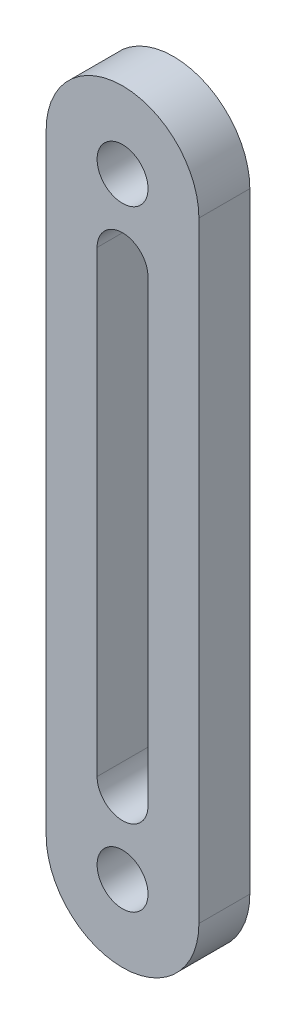
ISO-10303-21;
HEADER;
FILE_DESCRIPTION(('STEP AP214'),'2;1');
FILE_NAME('part.step','',(''),(''),'','','');
FILE_SCHEMA(('AUTOMOTIVE_DESIGN { 1 0 10303 214 1 1 1 1 }'));
ENDSEC;
DATA;
#1=APPLICATION_CONTEXT('core data for automotive mechanical design processes');
#2=APPLICATION_PROTOCOL_DEFINITION('international standard','automotive_design',2000,#1);
#3=PRODUCT_CONTEXT('',#1,'mechanical');
#4=PRODUCT('Part','Part','',(#3));
#5=PRODUCT_RELATED_PRODUCT_CATEGORY('part','',(#4));
#6=PRODUCT_DEFINITION_FORMATION('','',#4);
#7=PRODUCT_DEFINITION_CONTEXT('part definition',#1,'design');
#8=PRODUCT_DEFINITION('design','',#6,#7);
#9=PRODUCT_DEFINITION_SHAPE('','',#8);
#10=(LENGTH_UNIT() NAMED_UNIT(*) SI_UNIT(.MILLI.,.METRE.));
#11=(NAMED_UNIT(*) PLANE_ANGLE_UNIT() SI_UNIT($,.RADIAN.));
#12=(NAMED_UNIT(*) SI_UNIT($,.STERADIAN.) SOLID_ANGLE_UNIT());
#13=UNCERTAINTY_MEASURE_WITH_UNIT(LENGTH_MEASURE(1.E-05),#10,'distance_accuracy_value','');
#14=(GEOMETRIC_REPRESENTATION_CONTEXT(3) GLOBAL_UNCERTAINTY_ASSIGNED_CONTEXT((#13)) GLOBAL_UNIT_ASSIGNED_CONTEXT((#10,
#11,#12)) REPRESENTATION_CONTEXT('',''));
#15=CARTESIAN_POINT('',(0.,0.,0.));
#16=DIRECTION('',(0.,0.,1.));
#17=DIRECTION('',(1.,0.,0.));
#18=AXIS2_PLACEMENT_3D('',#15,#16,#17);
#19=CARTESIAN_POINT('',(208.7507761496,152.428489513,3.));
#20=DIRECTION('',(0.,0.,1.));
#21=DIRECTION('',(1.,0.,0.));
#22=AXIS2_PLACEMENT_3D('',#19,#20,#21);
#23=PLANE('',#22);
#24=CARTESIAN_POINT('',(208.7507761496,152.428489513,3.));
#25=DIRECTION('',(0.,0.,1.));
#26=DIRECTION('',(1.,0.,0.));
#27=AXIS2_PLACEMENT_3D('',#24,#25,#26);
#28=CIRCLE('',#27,1.5);
#29=CARTESIAN_POINT('',(210.2507761496,152.428489513,3.));
#30=VERTEX_POINT('',#29);
#31=EDGE_CURVE('E134',#30,#30,#28,.T.);
#32=ORIENTED_EDGE('',*,*,#31,.F.);
#33=EDGE_LOOP('',(#32));
#34=FACE_BOUND('',#33,.T.);
#35=CARTESIAN_POINT('',(208.7507761496,152.428489513,3.));
#36=DIRECTION('',(0.,0.,1.));
#37=DIRECTION('',(1.,0.,0.));
#38=AXIS2_PLACEMENT_3D('',#35,#36,#37);
#39=CIRCLE('',#38,4.5);
#40=CARTESIAN_POINT('',(204.2507761496,152.428489513,3.));
#41=VERTEX_POINT('',#40);
#42=CARTESIAN_POINT('',(213.2507761496,152.428489513,3.));
#43=VERTEX_POINT('',#42);
#44=EDGE_CURVE('E146',#41,#43,#39,.T.);
#45=ORIENTED_EDGE('',*,*,#44,.T.);
#46=DIRECTION('',(0.,1.,0.));
#47=VECTOR('',#46,1.);
#48=CARTESIAN_POINT('',(213.2507761496,152.428489513,3.));
#49=LINE('',#48,#47);
#50=CARTESIAN_POINT('',(213.2507761496,188.428489513,3.));
#51=VERTEX_POINT('',#50);
#52=EDGE_CURVE('E149',#43,#51,#49,.T.);
#53=ORIENTED_EDGE('',*,*,#52,.T.);
#54=CARTESIAN_POINT('',(208.7507761496,188.428489513,3.));
#55=DIRECTION('',(0.,0.,1.));
#56=DIRECTION('',(1.,0.,0.));
#57=AXIS2_PLACEMENT_3D('',#54,#55,#56);
#58=CIRCLE('',#57,4.5);
#59=CARTESIAN_POINT('',(204.2507761496,188.428489513,3.));
#60=VERTEX_POINT('',#59);
#61=EDGE_CURVE('E152',#51,#60,#58,.T.);
#62=ORIENTED_EDGE('',*,*,#61,.T.);
#63=DIRECTION('',(0.,-1.,0.));
#64=VECTOR('',#63,1.);
#65=CARTESIAN_POINT('',(204.2507761496,188.428489513,3.));
#66=LINE('',#65,#64);
#67=EDGE_CURVE('E154',#60,#41,#66,.T.);
#68=ORIENTED_EDGE('',*,*,#67,.T.);
#69=EDGE_LOOP('',(#45,#53,#62,#68));
#70=FACE_BOUND('',#69,.T.);
#71=CARTESIAN_POINT('',(208.7507761496,188.428489513,3.));
#72=DIRECTION('',(0.,0.,1.));
#73=DIRECTION('',(1.,0.,0.));
#74=AXIS2_PLACEMENT_3D('',#71,#72,#73);
#75=CIRCLE('',#74,1.5);
#76=CARTESIAN_POINT('',(210.2507761496,188.428489513,3.));
#77=VERTEX_POINT('',#76);
#78=EDGE_CURVE('E140',#77,#77,#75,.T.);
#79=ORIENTED_EDGE('',*,*,#78,.F.);
#80=EDGE_LOOP('',(#79));
#81=FACE_BOUND('',#80,.T.);
#82=DIRECTION('',(0.,-1.,0.));
#83=VECTOR('',#82,1.);
#84=CARTESIAN_POINT('',(207.2507761496,183.928489513,3.));
#85=LINE('',#84,#83);
#86=CARTESIAN_POINT('',(207.2507761496,183.928489513,3.));
#87=VERTEX_POINT('',#86);
#88=CARTESIAN_POINT('',(207.2507761496,156.928489513,3.));
#89=VERTEX_POINT('',#88);
#90=EDGE_CURVE('E106',#87,#89,#85,.T.);
#91=ORIENTED_EDGE('',*,*,#90,.F.);
#92=CARTESIAN_POINT('',(208.7507761496,183.928489513,3.));
#93=DIRECTION('',(0.,0.,1.));
#94=DIRECTION('',(1.,0.,0.));
#95=AXIS2_PLACEMENT_3D('',#92,#93,#94);
#96=CIRCLE('',#95,1.5);
#97=CARTESIAN_POINT('',(210.2507761496,183.928489513,3.));
#98=VERTEX_POINT('',#97);
#99=EDGE_CURVE('E98',#98,#87,#96,.T.);
#100=ORIENTED_EDGE('',*,*,#99,.F.);
#101=DIRECTION('',(0.,1.,0.));
#102=VECTOR('',#101,1.);
#103=CARTESIAN_POINT('',(210.2507761496,156.928489513,3.));
#104=LINE('',#103,#102);
#105=CARTESIAN_POINT('',(210.2507761496,156.928489513,3.));
#106=VERTEX_POINT('',#105);
#107=EDGE_CURVE('E120',#106,#98,#104,.T.);
#108=ORIENTED_EDGE('',*,*,#107,.F.);
#109=CARTESIAN_POINT('',(208.7507761496,156.928489513,3.));
#110=DIRECTION('',(0.,0.,1.));
#111=DIRECTION('',(1.,0.,0.));
#112=AXIS2_PLACEMENT_3D('',#109,#110,#111);
#113=CIRCLE('',#112,1.5);
#114=EDGE_CURVE('E118',#89,#106,#113,.T.);
#115=ORIENTED_EDGE('',*,*,#114,.F.);
#116=EDGE_LOOP('',(#91,#100,#108,#115));
#117=FACE_BOUND('',#116,.T.);
#118=ADVANCED_FACE('F33',(#34,#70,#81,#117),#23,.T.);
#119=CARTESIAN_POINT('',(208.7507761496,152.428489513,0.));
#120=DIRECTION('',(0.,0.,1.));
#121=DIRECTION('',(1.,0.,0.));
#122=AXIS2_PLACEMENT_3D('',#119,#120,#121);
#123=PLANE('',#122);
#124=CARTESIAN_POINT('',(208.7507761496,152.428489513,0.));
#125=DIRECTION('',(0.,0.,1.));
#126=DIRECTION('',(1.,0.,0.));
#127=AXIS2_PLACEMENT_3D('',#124,#125,#126);
#128=CIRCLE('',#127,1.5);
#129=CARTESIAN_POINT('',(210.2507761496,152.428489513,0.));
#130=VERTEX_POINT('',#129);
#131=EDGE_CURVE('E114',#130,#130,#128,.T.);
#132=ORIENTED_EDGE('',*,*,#131,.T.);
#133=EDGE_LOOP('',(#132));
#134=FACE_BOUND('',#133,.T.);
#135=CARTESIAN_POINT('',(208.7507761496,152.428489513,0.));
#136=DIRECTION('',(0.,0.,1.));
#137=DIRECTION('',(1.,0.,0.));
#138=AXIS2_PLACEMENT_3D('',#135,#136,#137);
#139=CIRCLE('',#138,4.5);
#140=CARTESIAN_POINT('',(204.2507761496,152.428489513,0.));
#141=VERTEX_POINT('',#140);
#142=CARTESIAN_POINT('',(213.2507761496,152.428489513,0.));
#143=VERTEX_POINT('',#142);
#144=EDGE_CURVE('E143',#141,#143,#139,.T.);
#145=ORIENTED_EDGE('',*,*,#144,.F.);
#146=DIRECTION('',(0.,-1.,0.));
#147=VECTOR('',#146,1.);
#148=CARTESIAN_POINT('',(204.2507761496,188.428489513,0.));
#149=LINE('',#148,#147);
#150=CARTESIAN_POINT('',(204.2507761496,188.428489513,0.));
#151=VERTEX_POINT('',#150);
#152=EDGE_CURVE('E150',#151,#141,#149,.T.);
#153=ORIENTED_EDGE('',*,*,#152,.F.);
#154=CARTESIAN_POINT('',(208.7507761496,188.428489513,0.));
#155=DIRECTION('',(0.,0.,1.));
#156=DIRECTION('',(1.,0.,0.));
#157=AXIS2_PLACEMENT_3D('',#154,#155,#156);
#158=CIRCLE('',#157,4.5);
#159=CARTESIAN_POINT('',(213.2507761496,188.428489513,0.));
#160=VERTEX_POINT('',#159);
#161=EDGE_CURVE('E161',#160,#151,#158,.T.);
#162=ORIENTED_EDGE('',*,*,#161,.F.);
#163=DIRECTION('',(0.,1.,0.));
#164=VECTOR('',#163,1.);
#165=CARTESIAN_POINT('',(213.2507761496,152.428489513,0.));
#166=LINE('',#165,#164);
#167=EDGE_CURVE('E159',#143,#160,#166,.T.);
#168=ORIENTED_EDGE('',*,*,#167,.F.);
#169=EDGE_LOOP('',(#145,#153,#162,#168));
#170=FACE_BOUND('',#169,.T.);
#171=CARTESIAN_POINT('',(208.7507761496,188.428489513,0.));
#172=DIRECTION('',(0.,0.,1.));
#173=DIRECTION('',(1.,0.,0.));
#174=AXIS2_PLACEMENT_3D('',#171,#172,#173);
#175=CIRCLE('',#174,1.5);
#176=CARTESIAN_POINT('',(210.2507761496,188.428489513,0.));
#177=VERTEX_POINT('',#176);
#178=EDGE_CURVE('E137',#177,#177,#175,.T.);
#179=ORIENTED_EDGE('',*,*,#178,.T.);
#180=EDGE_LOOP('',(#179));
#181=FACE_BOUND('',#180,.T.);
#182=CARTESIAN_POINT('',(208.7507761496,183.928489513,0.));
#183=DIRECTION('',(0.,0.,1.));
#184=DIRECTION('',(1.,0.,0.));
#185=AXIS2_PLACEMENT_3D('',#182,#183,#184);
#186=CIRCLE('',#185,1.5);
#187=CARTESIAN_POINT('',(210.2507761496,183.928489513,0.));
#188=VERTEX_POINT('',#187);
#189=CARTESIAN_POINT('',(207.2507761496,183.928489513,0.));
#190=VERTEX_POINT('',#189);
#191=EDGE_CURVE('E56',#188,#190,#186,.T.);
#192=ORIENTED_EDGE('',*,*,#191,.T.);
#193=DIRECTION('',(0.,-1.,0.));
#194=VECTOR('',#193,1.);
#195=CARTESIAN_POINT('',(207.2507761496,183.928489513,0.));
#196=LINE('',#195,#194);
#197=CARTESIAN_POINT('',(207.2507761496,156.928489513,0.));
#198=VERTEX_POINT('',#197);
#199=EDGE_CURVE('E113',#190,#198,#196,.T.);
#200=ORIENTED_EDGE('',*,*,#199,.T.);
#201=CARTESIAN_POINT('',(208.7507761496,156.928489513,0.));
#202=DIRECTION('',(0.,0.,1.));
#203=DIRECTION('',(1.,0.,0.));
#204=AXIS2_PLACEMENT_3D('',#201,#202,#203);
#205=CIRCLE('',#204,1.5);
#206=CARTESIAN_POINT('',(210.2507761496,156.928489513,0.));
#207=VERTEX_POINT('',#206);
#208=EDGE_CURVE('E126',#198,#207,#205,.T.);
#209=ORIENTED_EDGE('',*,*,#208,.T.);
#210=DIRECTION('',(0.,1.,0.));
#211=VECTOR('',#210,1.);
#212=CARTESIAN_POINT('',(210.2507761496,156.928489513,0.));
#213=LINE('',#212,#211);
#214=EDGE_CURVE('E107',#207,#188,#213,.T.);
#215=ORIENTED_EDGE('',*,*,#214,.T.);
#216=EDGE_LOOP('',(#192,#200,#209,#215));
#217=FACE_BOUND('',#216,.T.);
#218=ADVANCED_FACE('F179',(#134,#170,#181,#217),#123,.F.);
#219=CARTESIAN_POINT('',(208.7507761496,152.428489513,3.));
#220=DIRECTION('',(0.,0.,-1.));
#221=DIRECTION('',(-1.,0.,0.));
#222=AXIS2_PLACEMENT_3D('',#219,#220,#221);
#223=CYLINDRICAL_SURFACE('',#222,4.5);
#224=ORIENTED_EDGE('',*,*,#144,.T.);
#225=DIRECTION('',(0.,0.,-1.));
#226=VECTOR('',#225,1.);
#227=CARTESIAN_POINT('',(213.2507761496,152.428489513,3.));
#228=LINE('',#227,#226);
#229=EDGE_CURVE('E11',#43,#143,#228,.T.);
#230=ORIENTED_EDGE('',*,*,#229,.F.);
#231=ORIENTED_EDGE('',*,*,#44,.F.);
#232=DIRECTION('',(0.,0.,-1.));
#233=VECTOR('',#232,1.);
#234=CARTESIAN_POINT('',(204.2507761496,152.428489513,3.));
#235=LINE('',#234,#233);
#236=EDGE_CURVE('E156',#41,#141,#235,.T.);
#237=ORIENTED_EDGE('',*,*,#236,.T.);
#238=EDGE_LOOP('',(#224,#230,#231,#237));
#239=FACE_BOUND('',#238,.T.);
#240=ADVANCED_FACE('F35',(#239),#223,.T.);
#241=CARTESIAN_POINT('',(213.2507761496,152.428489513,3.));
#242=DIRECTION('',(-1.,0.,0.));
#243=DIRECTION('',(0.,0.,1.));
#244=AXIS2_PLACEMENT_3D('',#241,#242,#243);
#245=PLANE('',#244);
#246=ORIENTED_EDGE('',*,*,#167,.T.);
#247=DIRECTION('',(0.,0.,-1.));
#248=VECTOR('',#247,1.);
#249=CARTESIAN_POINT('',(213.2507761496,188.428489513,3.));
#250=LINE('',#249,#248);
#251=EDGE_CURVE('E41',#51,#160,#250,.T.);
#252=ORIENTED_EDGE('',*,*,#251,.F.);
#253=ORIENTED_EDGE('',*,*,#52,.F.);
#254=ORIENTED_EDGE('',*,*,#229,.T.);
#255=EDGE_LOOP('',(#246,#252,#253,#254));
#256=FACE_BOUND('',#255,.T.);
#257=ADVANCED_FACE('F190',(#256),#245,.F.);
#258=CARTESIAN_POINT('',(208.7507761496,188.428489513,3.));
#259=DIRECTION('',(0.,0.,-1.));
#260=DIRECTION('',(-1.,0.,0.));
#261=AXIS2_PLACEMENT_3D('',#258,#259,#260);
#262=CYLINDRICAL_SURFACE('',#261,4.5);
#263=ORIENTED_EDGE('',*,*,#161,.T.);
#264=DIRECTION('',(0.,0.,-1.));
#265=VECTOR('',#264,1.);
#266=CARTESIAN_POINT('',(204.2507761496,188.428489513,3.));
#267=LINE('',#266,#265);
#268=EDGE_CURVE('E166',#60,#151,#267,.T.);
#269=ORIENTED_EDGE('',*,*,#268,.F.);
#270=ORIENTED_EDGE('',*,*,#61,.F.);
#271=ORIENTED_EDGE('',*,*,#251,.T.);
#272=EDGE_LOOP('',(#263,#269,#270,#271));
#273=FACE_BOUND('',#272,.T.);
#274=ADVANCED_FACE('F173',(#273),#262,.T.);
#275=CARTESIAN_POINT('',(204.2507761496,188.428489513,3.));
#276=DIRECTION('',(1.,0.,0.));
#277=DIRECTION('',(0.,0.,-1.));
#278=AXIS2_PLACEMENT_3D('',#275,#276,#277);
#279=PLANE('',#278);
#280=ORIENTED_EDGE('',*,*,#152,.T.);
#281=ORIENTED_EDGE('',*,*,#236,.F.);
#282=ORIENTED_EDGE('',*,*,#67,.F.);
#283=ORIENTED_EDGE('',*,*,#268,.T.);
#284=EDGE_LOOP('',(#280,#281,#282,#283));
#285=FACE_BOUND('',#284,.T.);
#286=ADVANCED_FACE('F183',(#285),#279,.F.);
#287=CARTESIAN_POINT('',(208.7507761496,188.428489513,3.));
#288=DIRECTION('',(0.,0.,-1.));
#289=DIRECTION('',(-1.,0.,0.));
#290=AXIS2_PLACEMENT_3D('',#287,#288,#289);
#291=CYLINDRICAL_SURFACE('',#290,1.5);
#292=ORIENTED_EDGE('',*,*,#78,.T.);
#293=EDGE_LOOP('',(#292));
#294=FACE_BOUND('',#293,.T.);
#295=ORIENTED_EDGE('',*,*,#178,.F.);
#296=EDGE_LOOP('',(#295));
#297=FACE_BOUND('',#296,.T.);
#298=ADVANCED_FACE('F207',(#294,#297),#291,.F.);
#299=CARTESIAN_POINT('',(208.7507761496,152.428489513,3.));
#300=DIRECTION('',(0.,0.,-1.));
#301=DIRECTION('',(-1.,0.,0.));
#302=AXIS2_PLACEMENT_3D('',#299,#300,#301);
#303=CYLINDRICAL_SURFACE('',#302,1.5);
#304=ORIENTED_EDGE('',*,*,#31,.T.);
#305=EDGE_LOOP('',(#304));
#306=FACE_BOUND('',#305,.T.);
#307=ORIENTED_EDGE('',*,*,#131,.F.);
#308=EDGE_LOOP('',(#307));
#309=FACE_BOUND('',#308,.T.);
#310=ADVANCED_FACE('F214',(#306,#309),#303,.F.);
#311=CARTESIAN_POINT('',(208.7507761496,183.928489513,3.));
#312=DIRECTION('',(0.,0.,-1.));
#313=DIRECTION('',(-1.,0.,0.));
#314=AXIS2_PLACEMENT_3D('',#311,#312,#313);
#315=CYLINDRICAL_SURFACE('',#314,1.5);
#316=ORIENTED_EDGE('',*,*,#191,.F.);
#317=DIRECTION('',(0.,0.,-1.));
#318=VECTOR('',#317,1.);
#319=CARTESIAN_POINT('',(210.2507761496,183.928489513,3.));
#320=LINE('',#319,#318);
#321=EDGE_CURVE('E102',#98,#188,#320,.T.);
#322=ORIENTED_EDGE('',*,*,#321,.F.);
#323=ORIENTED_EDGE('',*,*,#99,.T.);
#324=DIRECTION('',(0.,0.,-1.));
#325=VECTOR('',#324,1.);
#326=CARTESIAN_POINT('',(207.2507761496,183.928489513,3.));
#327=LINE('',#326,#325);
#328=EDGE_CURVE('E101',#87,#190,#327,.T.);
#329=ORIENTED_EDGE('',*,*,#328,.T.);
#330=EDGE_LOOP('',(#316,#322,#323,#329));
#331=FACE_BOUND('',#330,.T.);
#332=ADVANCED_FACE('F100',(#331),#315,.F.);
#333=CARTESIAN_POINT('',(207.2507761496,183.928489513,3.));
#334=DIRECTION('',(1.,0.,0.));
#335=DIRECTION('',(0.,0.,-1.));
#336=AXIS2_PLACEMENT_3D('',#333,#334,#335);
#337=PLANE('',#336);
#338=ORIENTED_EDGE('',*,*,#199,.F.);
#339=ORIENTED_EDGE('',*,*,#328,.F.);
#340=ORIENTED_EDGE('',*,*,#90,.T.);
#341=DIRECTION('',(0.,0.,-1.));
#342=VECTOR('',#341,1.);
#343=CARTESIAN_POINT('',(207.2507761496,156.928489513,3.));
#344=LINE('',#343,#342);
#345=EDGE_CURVE('E115',#89,#198,#344,.T.);
#346=ORIENTED_EDGE('',*,*,#345,.T.);
#347=EDGE_LOOP('',(#338,#339,#340,#346));
#348=FACE_BOUND('',#347,.T.);
#349=ADVANCED_FACE('F110',(#348),#337,.T.);
#350=CARTESIAN_POINT('',(208.7507761496,156.928489513,3.));
#351=DIRECTION('',(0.,0.,-1.));
#352=DIRECTION('',(-1.,0.,0.));
#353=AXIS2_PLACEMENT_3D('',#350,#351,#352);
#354=CYLINDRICAL_SURFACE('',#353,1.5);
#355=ORIENTED_EDGE('',*,*,#208,.F.);
#356=ORIENTED_EDGE('',*,*,#345,.F.);
#357=ORIENTED_EDGE('',*,*,#114,.T.);
#358=DIRECTION('',(0.,0.,-1.));
#359=VECTOR('',#358,1.);
#360=CARTESIAN_POINT('',(210.2507761496,156.928489513,3.));
#361=LINE('',#360,#359);
#362=EDGE_CURVE('E48',#106,#207,#361,.T.);
#363=ORIENTED_EDGE('',*,*,#362,.T.);
#364=EDGE_LOOP('',(#355,#356,#357,#363));
#365=FACE_BOUND('',#364,.T.);
#366=ADVANCED_FACE('F227',(#365),#354,.F.);
#367=CARTESIAN_POINT('',(210.2507761496,156.928489513,3.));
#368=DIRECTION('',(-1.,0.,0.));
#369=DIRECTION('',(0.,0.,1.));
#370=AXIS2_PLACEMENT_3D('',#367,#368,#369);
#371=PLANE('',#370);
#372=ORIENTED_EDGE('',*,*,#214,.F.);
#373=ORIENTED_EDGE('',*,*,#362,.F.);
#374=ORIENTED_EDGE('',*,*,#107,.T.);
#375=ORIENTED_EDGE('',*,*,#321,.T.);
#376=EDGE_LOOP('',(#372,#373,#374,#375));
#377=FACE_BOUND('',#376,.T.);
#378=ADVANCED_FACE('F225',(#377),#371,.T.);
#379=CLOSED_SHELL('',(#118,#218,#240,#257,#274,#286,#298,#310,#332,#349,#366,#378));
#380=MANIFOLD_SOLID_BREP('B2',#379);
#381=ADVANCED_BREP_SHAPE_REPRESENTATION('',(#18,#380),#14);
#382=SHAPE_DEFINITION_REPRESENTATION(#9,#381);
ENDSEC;
END-ISO-10303-21;
